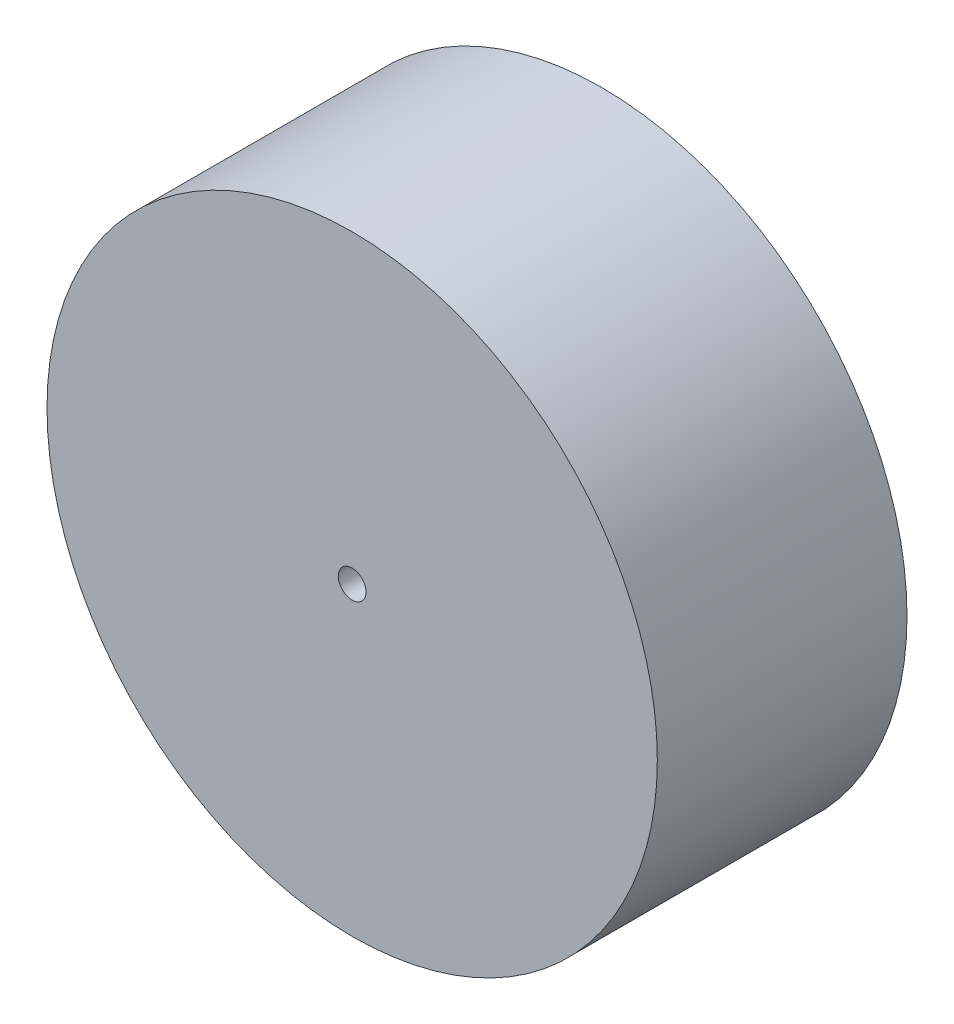
ISO-10303-21;
HEADER;
FILE_DESCRIPTION(('STEP AP214'),'2;1');
FILE_NAME('part.step','',(''),(''),'','','');
FILE_SCHEMA(('AUTOMOTIVE_DESIGN { 1 0 10303 214 1 1 1 1 }'));
ENDSEC;
DATA;
#1=APPLICATION_CONTEXT('core data for automotive mechanical design processes');
#2=APPLICATION_PROTOCOL_DEFINITION('international standard','automotive_design',2000,#1);
#3=PRODUCT_CONTEXT('',#1,'mechanical');
#4=PRODUCT('Part','Part','',(#3));
#5=PRODUCT_RELATED_PRODUCT_CATEGORY('part','',(#4));
#6=PRODUCT_DEFINITION_FORMATION('','',#4);
#7=PRODUCT_DEFINITION_CONTEXT('part definition',#1,'design');
#8=PRODUCT_DEFINITION('design','',#6,#7);
#9=PRODUCT_DEFINITION_SHAPE('','',#8);
#10=(LENGTH_UNIT() NAMED_UNIT(*) SI_UNIT(.MILLI.,.METRE.));
#11=(NAMED_UNIT(*) PLANE_ANGLE_UNIT() SI_UNIT($,.RADIAN.));
#12=(NAMED_UNIT(*) SI_UNIT($,.STERADIAN.) SOLID_ANGLE_UNIT());
#13=UNCERTAINTY_MEASURE_WITH_UNIT(LENGTH_MEASURE(1.E-05),#10,'distance_accuracy_value','');
#14=(GEOMETRIC_REPRESENTATION_CONTEXT(3) GLOBAL_UNCERTAINTY_ASSIGNED_CONTEXT((#13)) GLOBAL_UNIT_ASSIGNED_CONTEXT((#10,
#11,#12)) REPRESENTATION_CONTEXT('',''));
#15=CARTESIAN_POINT('',(0.,0.,0.));
#16=DIRECTION('',(0.,0.,1.));
#17=DIRECTION('',(1.,0.,0.));
#18=AXIS2_PLACEMENT_3D('',#15,#16,#17);
#19=CARTESIAN_POINT('',(0.,0.,27.));
#20=DIRECTION('',(0.,0.,-1.));
#21=DIRECTION('',(-1.,0.,0.));
#22=AXIS2_PLACEMENT_3D('',#19,#20,#21);
#23=CYLINDRICAL_SURFACE('',#22,33.);
#24=CARTESIAN_POINT('',(0.,0.,27.));
#25=DIRECTION('',(0.,0.,1.));
#26=DIRECTION('',(1.,0.,0.));
#27=AXIS2_PLACEMENT_3D('',#24,#25,#26);
#28=CIRCLE('',#27,33.);
#29=CARTESIAN_POINT('',(33.,0.,27.));
#30=VERTEX_POINT('',#29);
#31=EDGE_CURVE('E10',#30,#30,#28,.T.);
#32=ORIENTED_EDGE('',*,*,#31,.F.);
#33=EDGE_LOOP('',(#32));
#34=FACE_BOUND('',#33,.T.);
#35=CARTESIAN_POINT('',(0.,0.,0.));
#36=DIRECTION('',(0.,0.,1.));
#37=DIRECTION('',(1.,0.,0.));
#38=AXIS2_PLACEMENT_3D('',#35,#36,#37);
#39=CIRCLE('',#38,33.);
#40=CARTESIAN_POINT('',(33.,0.,0.));
#41=VERTEX_POINT('',#40);
#42=EDGE_CURVE('E36',#41,#41,#39,.T.);
#43=ORIENTED_EDGE('',*,*,#42,.T.);
#44=EDGE_LOOP('',(#43));
#45=FACE_BOUND('',#44,.T.);
#46=ADVANCED_FACE('F33',(#34,#45),#23,.T.);
#47=CARTESIAN_POINT('',(0.,0.,27.));
#48=DIRECTION('',(0.,0.,1.));
#49=DIRECTION('',(1.,0.,0.));
#50=AXIS2_PLACEMENT_3D('',#47,#48,#49);
#51=PLANE('',#50);
#52=CARTESIAN_POINT('',(0.,0.,27.));
#53=DIRECTION('',(0.,0.,1.));
#54=DIRECTION('',(1.,0.,0.));
#55=AXIS2_PLACEMENT_3D('',#52,#53,#54);
#56=CIRCLE('',#55,1.5);
#57=CARTESIAN_POINT('',(1.5,0.,27.));
#58=VERTEX_POINT('',#57);
#59=EDGE_CURVE('E45',#58,#58,#56,.T.);
#60=ORIENTED_EDGE('',*,*,#59,.F.);
#61=EDGE_LOOP('',(#60));
#62=FACE_BOUND('',#61,.T.);
#63=ORIENTED_EDGE('',*,*,#31,.T.);
#64=EDGE_LOOP('',(#63));
#65=FACE_BOUND('',#64,.T.);
#66=ADVANCED_FACE('F60',(#62,#65),#51,.T.);
#67=CARTESIAN_POINT('',(0.,0.,0.));
#68=DIRECTION('',(0.,0.,1.));
#69=DIRECTION('',(1.,0.,0.));
#70=AXIS2_PLACEMENT_3D('',#67,#68,#69);
#71=PLANE('',#70);
#72=CARTESIAN_POINT('',(0.,0.,0.));
#73=DIRECTION('',(0.,0.,1.));
#74=DIRECTION('',(1.,0.,0.));
#75=AXIS2_PLACEMENT_3D('',#72,#73,#74);
#76=CIRCLE('',#75,1.5);
#77=CARTESIAN_POINT('',(1.5,0.,0.));
#78=VERTEX_POINT('',#77);
#79=EDGE_CURVE('E43',#78,#78,#76,.T.);
#80=ORIENTED_EDGE('',*,*,#79,.T.);
#81=EDGE_LOOP('',(#80));
#82=FACE_BOUND('',#81,.T.);
#83=ORIENTED_EDGE('',*,*,#42,.F.);
#84=EDGE_LOOP('',(#83));
#85=FACE_BOUND('',#84,.T.);
#86=ADVANCED_FACE('F51',(#82,#85),#71,.F.);
#87=CARTESIAN_POINT('',(0.,0.,0.));
#88=DIRECTION('',(0.,0.,1.));
#89=DIRECTION('',(1.,0.,0.));
#90=AXIS2_PLACEMENT_3D('',#87,#88,#89);
#91=CYLINDRICAL_SURFACE('',#90,1.5);
#92=ORIENTED_EDGE('',*,*,#79,.F.);
#93=EDGE_LOOP('',(#92));
#94=FACE_BOUND('',#93,.T.);
#95=ORIENTED_EDGE('',*,*,#59,.T.);
#96=EDGE_LOOP('',(#95));
#97=FACE_BOUND('',#96,.T.);
#98=ADVANCED_FACE('F54',(#94,#97),#91,.F.);
#99=CLOSED_SHELL('',(#46,#66,#86,#98));
#100=MANIFOLD_SOLID_BREP('B2',#99);
#101=ADVANCED_BREP_SHAPE_REPRESENTATION('',(#18,#100),#14);
#102=SHAPE_DEFINITION_REPRESENTATION(#9,#101);
ENDSEC;
END-ISO-10303-21;
